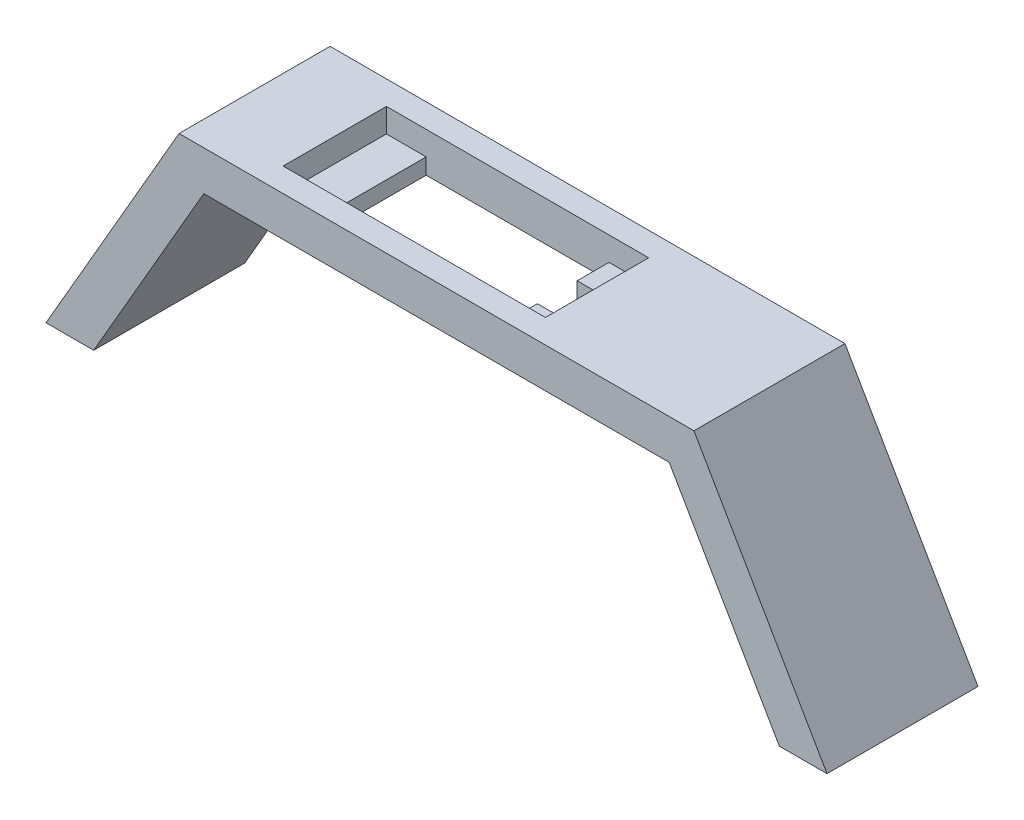
ISO-10303-21;
HEADER;
FILE_DESCRIPTION(('STEP AP214'),'2;1');
FILE_NAME('part.step','',(''),(''),'','','');
FILE_SCHEMA(('AUTOMOTIVE_DESIGN { 1 0 10303 214 1 1 1 1 }'));
ENDSEC;
DATA;
#1=APPLICATION_CONTEXT('core data for automotive mechanical design processes');
#2=APPLICATION_PROTOCOL_DEFINITION('international standard','automotive_design',2000,#1);
#3=PRODUCT_CONTEXT('',#1,'mechanical');
#4=PRODUCT('Part','Part','',(#3));
#5=PRODUCT_RELATED_PRODUCT_CATEGORY('part','',(#4));
#6=PRODUCT_DEFINITION_FORMATION('','',#4);
#7=PRODUCT_DEFINITION_CONTEXT('part definition',#1,'design');
#8=PRODUCT_DEFINITION('design','',#6,#7);
#9=PRODUCT_DEFINITION_SHAPE('','',#8);
#10=(LENGTH_UNIT() NAMED_UNIT(*) SI_UNIT(.MILLI.,.METRE.));
#11=(NAMED_UNIT(*) PLANE_ANGLE_UNIT() SI_UNIT($,.RADIAN.));
#12=(NAMED_UNIT(*) SI_UNIT($,.STERADIAN.) SOLID_ANGLE_UNIT());
#13=UNCERTAINTY_MEASURE_WITH_UNIT(LENGTH_MEASURE(1.E-05),#10,'distance_accuracy_value','');
#14=(GEOMETRIC_REPRESENTATION_CONTEXT(3) GLOBAL_UNCERTAINTY_ASSIGNED_CONTEXT((#13)) GLOBAL_UNIT_ASSIGNED_CONTEXT((#10,
#11,#12)) REPRESENTATION_CONTEXT('',''));
#15=CARTESIAN_POINT('',(0.,0.,0.));
#16=DIRECTION('',(0.,0.,1.));
#17=DIRECTION('',(1.,0.,0.));
#18=AXIS2_PLACEMENT_3D('',#15,#16,#17);
#19=CARTESIAN_POINT('',(0.,2.,0.));
#20=DIRECTION('',(0.,-1.,0.));
#21=DIRECTION('',(1.,0.,0.));
#22=AXIS2_PLACEMENT_3D('',#19,#20,#21);
#23=PLANE('',#22);
#24=DIRECTION('',(0.,0.,-1.));
#25=VECTOR('',#24,1.);
#26=CARTESIAN_POINT('',(5.7,2.,3.));
#27=LINE('',#26,#25);
#28=CARTESIAN_POINT('',(5.7,2.,7.));
#29=VERTEX_POINT('',#28);
#30=CARTESIAN_POINT('',(5.7,2.,3.));
#31=VERTEX_POINT('',#30);
#32=EDGE_CURVE('E202',#29,#31,#27,.T.);
#33=ORIENTED_EDGE('',*,*,#32,.F.);
#34=DIRECTION('',(-1.,0.,0.));
#35=VECTOR('',#34,1.);
#36=CARTESIAN_POINT('',(10.7,2.,7.));
#37=LINE('',#36,#35);
#38=CARTESIAN_POINT('',(10.7,2.,7.));
#39=VERTEX_POINT('',#38);
#40=EDGE_CURVE('E187',#39,#29,#37,.T.);
#41=ORIENTED_EDGE('',*,*,#40,.F.);
#42=DIRECTION('',(0.,0.,-1.));
#43=VECTOR('',#42,1.);
#44=CARTESIAN_POINT('',(10.7,2.00000000000001,3.));
#45=LINE('',#44,#43);
#46=CARTESIAN_POINT('',(10.7,2.00000000000001,3.));
#47=VERTEX_POINT('',#46);
#48=EDGE_CURVE('E228',#39,#47,#45,.T.);
#49=ORIENTED_EDGE('',*,*,#48,.T.);
#50=DIRECTION('',(-1.,0.,0.));
#51=VECTOR('',#50,1.);
#52=CARTESIAN_POINT('',(10.7,2.00000000000001,3.));
#53=LINE('',#52,#51);
#54=EDGE_CURVE('E231',#47,#31,#53,.T.);
#55=ORIENTED_EDGE('',*,*,#54,.T.);
#56=EDGE_LOOP('',(#33,#41,#49,#55));
#57=FACE_BOUND('',#56,.T.);
#58=ADVANCED_FACE('F42',(#57),#23,.F.);
#59=CARTESIAN_POINT('',(5.7,-24.001,3.));
#60=DIRECTION('',(1.,0.,0.));
#61=DIRECTION('',(0.,1.,0.));
#62=AXIS2_PLACEMENT_3D('',#59,#60,#61);
#63=PLANE('',#62);
#64=DIRECTION('',(0.,0.,1.));
#65=VECTOR('',#64,1.);
#66=CARTESIAN_POINT('',(5.7,1.14491749414469E-13,3.));
#67=LINE('',#66,#65);
#68=CARTESIAN_POINT('',(5.7,1.17020051753932E-13,3.));
#69=VERTEX_POINT('',#68);
#70=CARTESIAN_POINT('',(5.7,1.70002900645727E-13,7.));
#71=VERTEX_POINT('',#70);
#72=EDGE_CURVE('E206',#69,#71,#67,.T.);
#73=ORIENTED_EDGE('',*,*,#72,.T.);
#74=DIRECTION('',(0.,1.,0.));
#75=VECTOR('',#74,1.);
#76=CARTESIAN_POINT('',(5.7,-24.001,7.));
#77=LINE('',#76,#75);
#78=EDGE_CURVE('E639',#71,#29,#77,.T.);
#79=ORIENTED_EDGE('',*,*,#78,.T.);
#80=ORIENTED_EDGE('',*,*,#32,.T.);
#81=DIRECTION('',(0.,1.,0.));
#82=VECTOR('',#81,1.);
#83=CARTESIAN_POINT('',(5.7,-24.001,3.));
#84=LINE('',#83,#82);
#85=EDGE_CURVE('E204',#69,#31,#84,.T.);
#86=ORIENTED_EDGE('',*,*,#85,.F.);
#87=EDGE_LOOP('',(#73,#79,#80,#86));
#88=FACE_BOUND('',#87,.T.);
#89=ADVANCED_FACE('F356',(#88),#63,.F.);
#90=CARTESIAN_POINT('',(10.7,2.00000000000001,16.));
#91=VERTEX_POINT('',#90);
#92=CARTESIAN_POINT('',(10.7,2.,12.));
#93=VERTEX_POINT('',#92);
#94=EDGE_CURVE('E195',#91,#93,#45,.T.);
#95=ORIENTED_EDGE('',*,*,#94,.T.);
#96=DIRECTION('',(1.,0.,0.));
#97=VECTOR('',#96,1.);
#98=CARTESIAN_POINT('',(10.7,2.,12.));
#99=LINE('',#98,#97);
#100=CARTESIAN_POINT('',(5.7,2.,12.));
#101=VERTEX_POINT('',#100);
#102=EDGE_CURVE('E181',#101,#93,#99,.T.);
#103=ORIENTED_EDGE('',*,*,#102,.F.);
#104=CARTESIAN_POINT('',(5.7,2.,16.));
#105=VERTEX_POINT('',#104);
#106=EDGE_CURVE('E192',#105,#101,#27,.T.);
#107=ORIENTED_EDGE('',*,*,#106,.F.);
#108=DIRECTION('',(1.,0.,0.));
#109=VECTOR('',#108,1.);
#110=CARTESIAN_POINT('',(10.7,2.00000000000001,16.));
#111=LINE('',#110,#109);
#112=EDGE_CURVE('E223',#105,#91,#111,.T.);
#113=ORIENTED_EDGE('',*,*,#112,.T.);
#114=EDGE_LOOP('',(#95,#103,#107,#113));
#115=FACE_BOUND('',#114,.T.);
#116=ADVANCED_FACE('F191',(#115),#23,.F.);
#117=DIRECTION('',(0.,0.,1.));
#118=VECTOR('',#117,1.);
#119=CARTESIAN_POINT('',(-17.3,2.,3.));
#120=LINE('',#119,#118);
#121=CARTESIAN_POINT('',(-17.3,2.,3.));
#122=VERTEX_POINT('',#121);
#123=CARTESIAN_POINT('',(-17.3,2.,16.));
#124=VERTEX_POINT('',#123);
#125=EDGE_CURVE('E201',#122,#124,#120,.T.);
#126=ORIENTED_EDGE('',*,*,#125,.F.);
#127=CARTESIAN_POINT('',(-22.3,2.,3.));
#128=VERTEX_POINT('',#127);
#129=EDGE_CURVE('E230',#122,#128,#53,.T.);
#130=ORIENTED_EDGE('',*,*,#129,.T.);
#131=DIRECTION('',(0.,0.,1.));
#132=VECTOR('',#131,1.);
#133=CARTESIAN_POINT('',(-22.3,2.,3.));
#134=LINE('',#133,#132);
#135=CARTESIAN_POINT('',(-22.3,2.,16.));
#136=VERTEX_POINT('',#135);
#137=EDGE_CURVE('E220',#128,#136,#134,.T.);
#138=ORIENTED_EDGE('',*,*,#137,.T.);
#139=EDGE_CURVE('E225',#136,#124,#111,.T.);
#140=ORIENTED_EDGE('',*,*,#139,.T.);
#141=EDGE_LOOP('',(#126,#130,#138,#140));
#142=FACE_BOUND('',#141,.T.);
#143=ADVANCED_FACE('F359',(#142),#23,.F.);
#144=CARTESIAN_POINT('',(-43.14,-24.,19.));
#145=DIRECTION('',(-0.866025403784445,0.499999999999989,0.));
#146=DIRECTION('',(-0.499999999999989,-0.866025403784445,0.));
#147=AXIS2_PLACEMENT_3D('',#144,#145,#146);
#148=PLANE('',#147);
#149=DIRECTION('',(0.499999999999989,0.866025403784445,0.));
#150=VECTOR('',#149,1.);
#151=CARTESIAN_POINT('',(-43.14,-24.,0.));
#152=LINE('',#151,#150);
#153=CARTESIAN_POINT('',(-43.14,-24.,0.));
#154=VERTEX_POINT('',#153);
#155=CARTESIAN_POINT('',(-29.2835935394492,2.81672040281602E-13,0.));
#156=VERTEX_POINT('',#155);
#157=EDGE_CURVE('E246',#154,#156,#152,.T.);
#158=ORIENTED_EDGE('',*,*,#157,.T.);
#159=DIRECTION('',(0.,0.,-1.));
#160=VECTOR('',#159,1.);
#161=CARTESIAN_POINT('',(-29.2835935394492,2.81672040281602E-13,19.));
#162=LINE('',#161,#160);
#163=CARTESIAN_POINT('',(-29.2835935394492,2.81672040281602E-13,19.));
#164=VERTEX_POINT('',#163);
#165=EDGE_CURVE('E11',#164,#156,#162,.T.);
#166=ORIENTED_EDGE('',*,*,#165,.F.);
#167=DIRECTION('',(0.499999999999989,0.866025403784445,0.));
#168=VECTOR('',#167,1.);
#169=CARTESIAN_POINT('',(-43.14,-24.,19.));
#170=LINE('',#169,#168);
#171=CARTESIAN_POINT('',(-43.14,-24.,19.));
#172=VERTEX_POINT('',#171);
#173=EDGE_CURVE('E253',#172,#164,#170,.T.);
#174=ORIENTED_EDGE('',*,*,#173,.F.);
#175=DIRECTION('',(0.,0.,-1.));
#176=VECTOR('',#175,1.);
#177=CARTESIAN_POINT('',(-43.14,-24.,19.));
#178=LINE('',#177,#176);
#179=EDGE_CURVE('E271',#172,#154,#178,.T.);
#180=ORIENTED_EDGE('',*,*,#179,.T.);
#181=EDGE_LOOP('',(#158,#166,#174,#180));
#182=FACE_BOUND('',#181,.T.);
#183=ADVANCED_FACE('F44',(#182),#148,.F.);
#184=CARTESIAN_POINT('',(-29.2835935394492,2.81672040281602E-13,19.));
#185=DIRECTION('',(0.,1.,0.));
#186=DIRECTION('',(-1.,0.,0.));
#187=AXIS2_PLACEMENT_3D('',#184,#185,#186);
#188=PLANE('',#187);
#189=DIRECTION('',(0.,0.,1.));
#190=VECTOR('',#189,1.);
#191=CARTESIAN_POINT('',(10.7,0.,7.));
#192=LINE('',#191,#190);
#193=CARTESIAN_POINT('',(10.7,0.,7.));
#194=VERTEX_POINT('',#193);
#195=CARTESIAN_POINT('',(10.7,1.04083408558608E-13,12.));
#196=VERTEX_POINT('',#195);
#197=EDGE_CURVE('E642',#194,#196,#192,.T.);
#198=ORIENTED_EDGE('',*,*,#197,.F.);
#199=DIRECTION('',(1.,0.,0.));
#200=VECTOR('',#199,1.);
#201=CARTESIAN_POINT('',(10.7000000000001,0.,7.));
#202=LINE('',#201,#200);
#203=EDGE_CURVE('E196',#71,#194,#202,.T.);
#204=ORIENTED_EDGE('',*,*,#203,.F.);
#205=ORIENTED_EDGE('',*,*,#72,.F.);
#206=DIRECTION('',(1.,0.,0.));
#207=VECTOR('',#206,1.);
#208=CARTESIAN_POINT('',(-17.2999999999999,2.25514051876985E-13,3.));
#209=LINE('',#208,#207);
#210=CARTESIAN_POINT('',(-17.3,2.25143866414488E-13,3.));
#211=VERTEX_POINT('',#210);
#212=EDGE_CURVE('E211',#211,#69,#209,.T.);
#213=ORIENTED_EDGE('',*,*,#212,.F.);
#214=DIRECTION('',(0.,0.,-1.));
#215=VECTOR('',#214,1.);
#216=CARTESIAN_POINT('',(-17.3,2.25514051876985E-13,3.));
#217=LINE('',#216,#215);
#218=CARTESIAN_POINT('',(-17.3,2.25514051876985E-13,16.));
#219=VERTEX_POINT('',#218);
#220=EDGE_CURVE('E652',#219,#211,#217,.T.);
#221=ORIENTED_EDGE('',*,*,#220,.F.);
#222=DIRECTION('',(-1.,0.,0.));
#223=VECTOR('',#222,1.);
#224=CARTESIAN_POINT('',(-17.2999999999999,2.25514051876985E-13,16.));
#225=LINE('',#224,#223);
#226=CARTESIAN_POINT('',(5.7,1.70002900645727E-13,16.));
#227=VERTEX_POINT('',#226);
#228=EDGE_CURVE('E653',#227,#219,#225,.T.);
#229=ORIENTED_EDGE('',*,*,#228,.F.);
#230=CARTESIAN_POINT('',(5.7,1.14491749414469E-13,12.));
#231=VERTEX_POINT('',#230);
#232=EDGE_CURVE('E655',#231,#227,#67,.T.);
#233=ORIENTED_EDGE('',*,*,#232,.F.);
#234=DIRECTION('',(-1.,0.,0.));
#235=VECTOR('',#234,1.);
#236=CARTESIAN_POINT('',(10.7000000000001,0.,12.));
#237=LINE('',#236,#235);
#238=EDGE_CURVE('E57',#196,#231,#237,.T.);
#239=ORIENTED_EDGE('',*,*,#238,.F.);
#240=EDGE_LOOP('',(#198,#204,#205,#213,#221,#229,#233,#239));
#241=FACE_BOUND('',#240,.T.);
#242=DIRECTION('',(1.,0.,0.));
#243=VECTOR('',#242,1.);
#244=CARTESIAN_POINT('',(-29.2835935394492,2.81672040281602E-13,0.));
#245=LINE('',#244,#243);
#246=CARTESIAN_POINT('',(29.2835935394491,0.,0.));
#247=VERTEX_POINT('',#246);
#248=EDGE_CURVE('E274',#156,#247,#245,.T.);
#249=ORIENTED_EDGE('',*,*,#248,.T.);
#250=DIRECTION('',(0.,0.,-1.));
#251=VECTOR('',#250,1.);
#252=CARTESIAN_POINT('',(29.2835935394491,0.,19.));
#253=LINE('',#252,#251);
#254=CARTESIAN_POINT('',(29.2835935394491,0.,19.));
#255=VERTEX_POINT('',#254);
#256=EDGE_CURVE('E50',#255,#247,#253,.T.);
#257=ORIENTED_EDGE('',*,*,#256,.F.);
#258=DIRECTION('',(1.,0.,0.));
#259=VECTOR('',#258,1.);
#260=CARTESIAN_POINT('',(-29.2835935394492,2.81672040281602E-13,19.));
#261=LINE('',#260,#259);
#262=EDGE_CURVE('E256',#164,#255,#261,.T.);
#263=ORIENTED_EDGE('',*,*,#262,.F.);
#264=ORIENTED_EDGE('',*,*,#165,.T.);
#265=EDGE_LOOP('',(#249,#257,#263,#264));
#266=FACE_BOUND('',#265,.T.);
#267=ADVANCED_FACE('F331',(#241,#266),#188,.F.);
#268=CARTESIAN_POINT('',(29.2835935394491,0.,19.));
#269=DIRECTION('',(0.86602540378444,0.499999999999998,0.));
#270=DIRECTION('',(-0.499999999999998,0.86602540378444,0.));
#271=AXIS2_PLACEMENT_3D('',#268,#269,#270);
#272=PLANE('',#271);
#273=DIRECTION('',(0.499999999999998,-0.86602540378444,0.));
#274=VECTOR('',#273,1.);
#275=CARTESIAN_POINT('',(29.2835935394491,0.,0.));
#276=LINE('',#275,#274);
#277=CARTESIAN_POINT('',(43.14,-24.,0.));
#278=VERTEX_POINT('',#277);
#279=EDGE_CURVE('E276',#247,#278,#276,.T.);
#280=ORIENTED_EDGE('',*,*,#279,.T.);
#281=DIRECTION('',(0.,0.,-1.));
#282=VECTOR('',#281,1.);
#283=CARTESIAN_POINT('',(43.14,-24.,19.));
#284=LINE('',#283,#282);
#285=CARTESIAN_POINT('',(43.14,-24.,19.));
#286=VERTEX_POINT('',#285);
#287=EDGE_CURVE('E301',#286,#278,#284,.T.);
#288=ORIENTED_EDGE('',*,*,#287,.F.);
#289=DIRECTION('',(0.499999999999998,-0.86602540378444,0.));
#290=VECTOR('',#289,1.);
#291=CARTESIAN_POINT('',(29.2835935394491,0.,19.));
#292=LINE('',#291,#290);
#293=EDGE_CURVE('E259',#255,#286,#292,.T.);
#294=ORIENTED_EDGE('',*,*,#293,.F.);
#295=ORIENTED_EDGE('',*,*,#256,.T.);
#296=EDGE_LOOP('',(#280,#288,#294,#295));
#297=FACE_BOUND('',#296,.T.);
#298=ADVANCED_FACE('F308',(#297),#272,.F.);
#299=CARTESIAN_POINT('',(43.14,-24.,19.));
#300=DIRECTION('',(0.,1.,0.));
#301=DIRECTION('',(-1.,0.,0.));
#302=AXIS2_PLACEMENT_3D('',#299,#300,#301);
#303=PLANE('',#302);
#304=DIRECTION('',(1.,0.,0.));
#305=VECTOR('',#304,1.);
#306=CARTESIAN_POINT('',(43.14,-24.,0.));
#307=LINE('',#306,#305);
#308=CARTESIAN_POINT('',(49.14,-24.,0.));
#309=VERTEX_POINT('',#308);
#310=EDGE_CURVE('E278',#278,#309,#307,.T.);
#311=ORIENTED_EDGE('',*,*,#310,.T.);
#312=DIRECTION('',(0.,0.,-1.));
#313=VECTOR('',#312,1.);
#314=CARTESIAN_POINT('',(49.14,-24.,19.));
#315=LINE('',#314,#313);
#316=CARTESIAN_POINT('',(49.14,-24.,19.));
#317=VERTEX_POINT('',#316);
#318=EDGE_CURVE('E298',#317,#309,#315,.T.);
#319=ORIENTED_EDGE('',*,*,#318,.F.);
#320=DIRECTION('',(1.,0.,0.));
#321=VECTOR('',#320,1.);
#322=CARTESIAN_POINT('',(43.14,-24.,19.));
#323=LINE('',#322,#321);
#324=EDGE_CURVE('E261',#286,#317,#323,.T.);
#325=ORIENTED_EDGE('',*,*,#324,.F.);
#326=ORIENTED_EDGE('',*,*,#287,.T.);
#327=EDGE_LOOP('',(#311,#319,#325,#326));
#328=FACE_BOUND('',#327,.T.);
#329=ADVANCED_FACE('F319',(#328),#303,.F.);
#330=CARTESIAN_POINT('',(49.14,-24.,19.));
#331=DIRECTION('',(-0.86602540378444,-0.499999999999997,0.));
#332=DIRECTION('',(0.499999999999997,-0.86602540378444,0.));
#333=AXIS2_PLACEMENT_3D('',#330,#331,#332);
#334=PLANE('',#333);
#335=DIRECTION('',(-0.499999999999997,0.86602540378444,0.));
#336=VECTOR('',#335,1.);
#337=CARTESIAN_POINT('',(49.14,-24.,0.));
#338=LINE('',#337,#336);
#339=CARTESIAN_POINT('',(32.396842193501,5.00000000000001,0.));
#340=VERTEX_POINT('',#339);
#341=EDGE_CURVE('E280',#309,#340,#338,.T.);
#342=ORIENTED_EDGE('',*,*,#341,.T.);
#343=DIRECTION('',(0.,0.,-1.));
#344=VECTOR('',#343,1.);
#345=CARTESIAN_POINT('',(32.396842193501,5.00000000000001,19.));
#346=LINE('',#345,#344);
#347=CARTESIAN_POINT('',(32.396842193501,5.00000000000001,19.));
#348=VERTEX_POINT('',#347);
#349=EDGE_CURVE('E295',#348,#340,#346,.T.);
#350=ORIENTED_EDGE('',*,*,#349,.F.);
#351=DIRECTION('',(-0.499999999999997,0.86602540378444,0.));
#352=VECTOR('',#351,1.);
#353=CARTESIAN_POINT('',(49.14,-24.,19.));
#354=LINE('',#353,#352);
#355=EDGE_CURVE('E263',#317,#348,#354,.T.);
#356=ORIENTED_EDGE('',*,*,#355,.F.);
#357=ORIENTED_EDGE('',*,*,#318,.T.);
#358=EDGE_LOOP('',(#342,#350,#356,#357));
#359=FACE_BOUND('',#358,.T.);
#360=ADVANCED_FACE('F323',(#359),#334,.F.);
#361=CARTESIAN_POINT('',(32.396842193501,5.00000000000001,19.));
#362=DIRECTION('',(0.,-1.,0.));
#363=DIRECTION('',(1.,0.,0.));
#364=AXIS2_PLACEMENT_3D('',#361,#362,#363);
#365=PLANE('',#364);
#366=DIRECTION('',(1.,0.,0.));
#367=VECTOR('',#366,1.);
#368=CARTESIAN_POINT('',(10.7,5.00000000000001,16.));
#369=LINE('',#368,#367);
#370=CARTESIAN_POINT('',(-22.3,5.,16.));
#371=VERTEX_POINT('',#370);
#372=CARTESIAN_POINT('',(10.7,5.00000000000001,16.));
#373=VERTEX_POINT('',#372);
#374=EDGE_CURVE('E236',#371,#373,#369,.T.);
#375=ORIENTED_EDGE('',*,*,#374,.F.);
#376=DIRECTION('',(0.,0.,1.));
#377=VECTOR('',#376,1.);
#378=CARTESIAN_POINT('',(-22.3,5.,3.));
#379=LINE('',#378,#377);
#380=CARTESIAN_POINT('',(-22.3,5.,3.));
#381=VERTEX_POINT('',#380);
#382=EDGE_CURVE('E219',#381,#371,#379,.T.);
#383=ORIENTED_EDGE('',*,*,#382,.F.);
#384=DIRECTION('',(-1.,0.,0.));
#385=VECTOR('',#384,1.);
#386=CARTESIAN_POINT('',(10.7,5.00000000000001,3.));
#387=LINE('',#386,#385);
#388=CARTESIAN_POINT('',(10.7,5.00000000000001,3.));
#389=VERTEX_POINT('',#388);
#390=EDGE_CURVE('E224',#389,#381,#387,.T.);
#391=ORIENTED_EDGE('',*,*,#390,.F.);
#392=DIRECTION('',(0.,0.,-1.));
#393=VECTOR('',#392,1.);
#394=CARTESIAN_POINT('',(10.7,5.00000000000001,3.));
#395=LINE('',#394,#393);
#396=EDGE_CURVE('E239',#373,#389,#395,.T.);
#397=ORIENTED_EDGE('',*,*,#396,.F.);
#398=EDGE_LOOP('',(#375,#383,#391,#397));
#399=FACE_BOUND('',#398,.T.);
#400=DIRECTION('',(-1.,0.,0.));
#401=VECTOR('',#400,1.);
#402=CARTESIAN_POINT('',(32.396842193501,5.00000000000001,0.));
#403=LINE('',#402,#401);
#404=CARTESIAN_POINT('',(-32.396842193501,5.,0.));
#405=VERTEX_POINT('',#404);
#406=EDGE_CURVE('E282',#340,#405,#403,.T.);
#407=ORIENTED_EDGE('',*,*,#406,.T.);
#408=DIRECTION('',(0.,0.,-1.));
#409=VECTOR('',#408,1.);
#410=CARTESIAN_POINT('',(-32.396842193501,5.,19.));
#411=LINE('',#410,#409);
#412=CARTESIAN_POINT('',(-32.396842193501,5.,19.));
#413=VERTEX_POINT('',#412);
#414=EDGE_CURVE('E292',#413,#405,#411,.T.);
#415=ORIENTED_EDGE('',*,*,#414,.F.);
#416=DIRECTION('',(-1.,0.,0.));
#417=VECTOR('',#416,1.);
#418=CARTESIAN_POINT('',(32.396842193501,5.00000000000001,19.));
#419=LINE('',#418,#417);
#420=EDGE_CURVE('E265',#348,#413,#419,.T.);
#421=ORIENTED_EDGE('',*,*,#420,.F.);
#422=ORIENTED_EDGE('',*,*,#349,.T.);
#423=EDGE_LOOP('',(#407,#415,#421,#422));
#424=FACE_BOUND('',#423,.T.);
#425=ADVANCED_FACE('F344',(#399,#424),#365,.F.);
#426=CARTESIAN_POINT('',(-32.396842193501,5.,19.));
#427=DIRECTION('',(0.86602540378444,-0.499999999999998,0.));
#428=DIRECTION('',(0.499999999999998,0.86602540378444,0.));
#429=AXIS2_PLACEMENT_3D('',#426,#427,#428);
#430=PLANE('',#429);
#431=DIRECTION('',(-0.499999999999998,-0.86602540378444,0.));
#432=VECTOR('',#431,1.);
#433=CARTESIAN_POINT('',(-32.396842193501,5.,0.));
#434=LINE('',#433,#432);
#435=CARTESIAN_POINT('',(-49.14,-24.,0.));
#436=VERTEX_POINT('',#435);
#437=EDGE_CURVE('E284',#405,#436,#434,.T.);
#438=ORIENTED_EDGE('',*,*,#437,.T.);
#439=DIRECTION('',(0.,0.,-1.));
#440=VECTOR('',#439,1.);
#441=CARTESIAN_POINT('',(-49.14,-24.,19.));
#442=LINE('',#441,#440);
#443=CARTESIAN_POINT('',(-49.14,-24.,19.));
#444=VERTEX_POINT('',#443);
#445=EDGE_CURVE('E289',#444,#436,#442,.T.);
#446=ORIENTED_EDGE('',*,*,#445,.F.);
#447=DIRECTION('',(-0.499999999999998,-0.86602540378444,0.));
#448=VECTOR('',#447,1.);
#449=CARTESIAN_POINT('',(-32.396842193501,5.,19.));
#450=LINE('',#449,#448);
#451=EDGE_CURVE('E267',#413,#444,#450,.T.);
#452=ORIENTED_EDGE('',*,*,#451,.F.);
#453=ORIENTED_EDGE('',*,*,#414,.T.);
#454=EDGE_LOOP('',(#438,#446,#452,#453));
#455=FACE_BOUND('',#454,.T.);
#456=ADVANCED_FACE('F342',(#455),#430,.F.);
#457=CARTESIAN_POINT('',(-49.14,-24.,19.));
#458=DIRECTION('',(0.,1.,0.));
#459=DIRECTION('',(0.,0.,1.));
#460=AXIS2_PLACEMENT_3D('',#457,#458,#459);
#461=PLANE('',#460);
#462=DIRECTION('',(1.,0.,0.));
#463=VECTOR('',#462,1.);
#464=CARTESIAN_POINT('',(-49.14,-24.,0.));
#465=LINE('',#464,#463);
#466=EDGE_CURVE('E257',#436,#154,#465,.T.);
#467=ORIENTED_EDGE('',*,*,#466,.T.);
#468=ORIENTED_EDGE('',*,*,#179,.F.);
#469=DIRECTION('',(1.,0.,0.));
#470=VECTOR('',#469,1.);
#471=CARTESIAN_POINT('',(-49.14,-24.,19.));
#472=LINE('',#471,#470);
#473=EDGE_CURVE('E269',#444,#172,#472,.T.);
#474=ORIENTED_EDGE('',*,*,#473,.F.);
#475=ORIENTED_EDGE('',*,*,#445,.T.);
#476=EDGE_LOOP('',(#467,#468,#474,#475));
#477=FACE_BOUND('',#476,.T.);
#478=ADVANCED_FACE('F337',(#477),#461,.F.);
#479=CARTESIAN_POINT('',(0.,0.,19.));
#480=DIRECTION('',(0.,0.,-1.));
#481=DIRECTION('',(-1.,0.,0.));
#482=AXIS2_PLACEMENT_3D('',#479,#480,#481);
#483=PLANE('',#482);
#484=ORIENTED_EDGE('',*,*,#173,.T.);
#485=ORIENTED_EDGE('',*,*,#262,.T.);
#486=ORIENTED_EDGE('',*,*,#293,.T.);
#487=ORIENTED_EDGE('',*,*,#324,.T.);
#488=ORIENTED_EDGE('',*,*,#355,.T.);
#489=ORIENTED_EDGE('',*,*,#420,.T.);
#490=ORIENTED_EDGE('',*,*,#451,.T.);
#491=ORIENTED_EDGE('',*,*,#473,.T.);
#492=EDGE_LOOP('',(#484,#485,#486,#487,#488,#489,#490,#491));
#493=FACE_BOUND('',#492,.T.);
#494=ADVANCED_FACE('F327',(#493),#483,.F.);
#495=CARTESIAN_POINT('',(0.,0.,0.));
#496=DIRECTION('',(0.,0.,-1.));
#497=DIRECTION('',(-1.,0.,0.));
#498=AXIS2_PLACEMENT_3D('',#495,#496,#497);
#499=PLANE('',#498);
#500=ORIENTED_EDGE('',*,*,#157,.F.);
#501=ORIENTED_EDGE('',*,*,#466,.F.);
#502=ORIENTED_EDGE('',*,*,#437,.F.);
#503=ORIENTED_EDGE('',*,*,#406,.F.);
#504=ORIENTED_EDGE('',*,*,#341,.F.);
#505=ORIENTED_EDGE('',*,*,#310,.F.);
#506=ORIENTED_EDGE('',*,*,#279,.F.);
#507=ORIENTED_EDGE('',*,*,#248,.F.);
#508=EDGE_LOOP('',(#500,#501,#502,#503,#504,#505,#506,#507));
#509=FACE_BOUND('',#508,.T.);
#510=ADVANCED_FACE('F314',(#509),#499,.T.);
#511=CARTESIAN_POINT('',(-22.3,2.,3.));
#512=DIRECTION('',(-1.,0.,0.));
#513=DIRECTION('',(0.,0.,1.));
#514=AXIS2_PLACEMENT_3D('',#511,#512,#513);
#515=PLANE('',#514);
#516=ORIENTED_EDGE('',*,*,#382,.T.);
#517=DIRECTION('',(0.,1.,0.));
#518=VECTOR('',#517,1.);
#519=CARTESIAN_POINT('',(-22.3,2.,16.));
#520=LINE('',#519,#518);
#521=EDGE_CURVE('E234',#136,#371,#520,.T.);
#522=ORIENTED_EDGE('',*,*,#521,.F.);
#523=ORIENTED_EDGE('',*,*,#137,.F.);
#524=DIRECTION('',(0.,1.,0.));
#525=VECTOR('',#524,1.);
#526=CARTESIAN_POINT('',(-22.3,2.,3.));
#527=LINE('',#526,#525);
#528=EDGE_CURVE('E244',#128,#381,#527,.T.);
#529=ORIENTED_EDGE('',*,*,#528,.T.);
#530=EDGE_LOOP('',(#516,#522,#523,#529));
#531=FACE_BOUND('',#530,.T.);
#532=ADVANCED_FACE('F441',(#531),#515,.F.);
#533=CARTESIAN_POINT('',(10.7,2.00000000000001,3.));
#534=DIRECTION('',(0.,0.,-1.));
#535=DIRECTION('',(-1.,0.,0.));
#536=AXIS2_PLACEMENT_3D('',#533,#534,#535);
#537=PLANE('',#536);
#538=ORIENTED_EDGE('',*,*,#390,.T.);
#539=ORIENTED_EDGE('',*,*,#528,.F.);
#540=ORIENTED_EDGE('',*,*,#129,.F.);
#541=DIRECTION('',(0.,1.,0.));
#542=VECTOR('',#541,1.);
#543=CARTESIAN_POINT('',(-17.3,-24.001,3.));
#544=LINE('',#543,#542);
#545=EDGE_CURVE('E65',#211,#122,#544,.T.);
#546=ORIENTED_EDGE('',*,*,#545,.F.);
#547=ORIENTED_EDGE('',*,*,#212,.T.);
#548=ORIENTED_EDGE('',*,*,#85,.T.);
#549=ORIENTED_EDGE('',*,*,#54,.F.);
#550=DIRECTION('',(0.,1.,0.));
#551=VECTOR('',#550,1.);
#552=CARTESIAN_POINT('',(10.7,2.00000000000001,3.));
#553=LINE('',#552,#551);
#554=EDGE_CURVE('E247',#47,#389,#553,.T.);
#555=ORIENTED_EDGE('',*,*,#554,.T.);
#556=EDGE_LOOP('',(#538,#539,#540,#546,#547,#548,#549,#555));
#557=FACE_BOUND('',#556,.T.);
#558=ADVANCED_FACE('F449',(#557),#537,.F.);
#559=CARTESIAN_POINT('',(10.7,2.00000000000001,3.));
#560=DIRECTION('',(1.,0.,0.));
#561=DIRECTION('',(0.,1.,0.));
#562=AXIS2_PLACEMENT_3D('',#559,#560,#561);
#563=PLANE('',#562);
#564=ORIENTED_EDGE('',*,*,#396,.T.);
#565=ORIENTED_EDGE('',*,*,#554,.F.);
#566=ORIENTED_EDGE('',*,*,#48,.F.);
#567=DIRECTION('',(0.,1.,0.));
#568=VECTOR('',#567,1.);
#569=CARTESIAN_POINT('',(10.7,-24.001,7.));
#570=LINE('',#569,#568);
#571=EDGE_CURVE('E636',#194,#39,#570,.T.);
#572=ORIENTED_EDGE('',*,*,#571,.F.);
#573=ORIENTED_EDGE('',*,*,#197,.T.);
#574=DIRECTION('',(0.,1.,0.));
#575=VECTOR('',#574,1.);
#576=CARTESIAN_POINT('',(10.7,-24.001,12.));
#577=LINE('',#576,#575);
#578=EDGE_CURVE('E186',#196,#93,#577,.T.);
#579=ORIENTED_EDGE('',*,*,#578,.T.);
#580=ORIENTED_EDGE('',*,*,#94,.F.);
#581=DIRECTION('',(0.,1.,0.));
#582=VECTOR('',#581,1.);
#583=CARTESIAN_POINT('',(10.7,2.00000000000001,16.));
#584=LINE('',#583,#582);
#585=EDGE_CURVE('E249',#91,#373,#584,.T.);
#586=ORIENTED_EDGE('',*,*,#585,.T.);
#587=EDGE_LOOP('',(#564,#565,#566,#572,#573,#579,#580,#586));
#588=FACE_BOUND('',#587,.T.);
#589=ADVANCED_FACE('F459',(#588),#563,.F.);
#590=CARTESIAN_POINT('',(10.7,2.00000000000001,16.));
#591=DIRECTION('',(0.,0.,1.));
#592=DIRECTION('',(1.,0.,0.));
#593=AXIS2_PLACEMENT_3D('',#590,#591,#592);
#594=PLANE('',#593);
#595=ORIENTED_EDGE('',*,*,#374,.T.);
#596=ORIENTED_EDGE('',*,*,#585,.F.);
#597=ORIENTED_EDGE('',*,*,#112,.F.);
#598=DIRECTION('',(0.,1.,0.));
#599=VECTOR('',#598,1.);
#600=CARTESIAN_POINT('',(5.7,-24.001,16.));
#601=LINE('',#600,#599);
#602=EDGE_CURVE('E200',#227,#105,#601,.T.);
#603=ORIENTED_EDGE('',*,*,#602,.F.);
#604=ORIENTED_EDGE('',*,*,#228,.T.);
#605=DIRECTION('',(0.,1.,0.));
#606=VECTOR('',#605,1.);
#607=CARTESIAN_POINT('',(-17.3,-24.001,16.));
#608=LINE('',#607,#606);
#609=EDGE_CURVE('E212',#219,#124,#608,.T.);
#610=ORIENTED_EDGE('',*,*,#609,.T.);
#611=ORIENTED_EDGE('',*,*,#139,.F.);
#612=ORIENTED_EDGE('',*,*,#521,.T.);
#613=EDGE_LOOP('',(#595,#596,#597,#603,#604,#610,#611,#612));
#614=FACE_BOUND('',#613,.T.);
#615=ADVANCED_FACE('F469',(#614),#594,.F.);
#616=ORIENTED_EDGE('',*,*,#106,.T.);
#617=DIRECTION('',(0.,1.,0.));
#618=VECTOR('',#617,1.);
#619=CARTESIAN_POINT('',(5.7,-24.001,12.));
#620=LINE('',#619,#618);
#621=EDGE_CURVE('E178',#231,#101,#620,.T.);
#622=ORIENTED_EDGE('',*,*,#621,.F.);
#623=ORIENTED_EDGE('',*,*,#232,.T.);
#624=ORIENTED_EDGE('',*,*,#602,.T.);
#625=EDGE_LOOP('',(#616,#622,#623,#624));
#626=FACE_BOUND('',#625,.T.);
#627=ADVANCED_FACE('F198',(#626),#63,.F.);
#628=CARTESIAN_POINT('',(-17.3,-24.001,3.));
#629=DIRECTION('',(-1.,0.,0.));
#630=DIRECTION('',(0.,0.,1.));
#631=AXIS2_PLACEMENT_3D('',#628,#629,#630);
#632=PLANE('',#631);
#633=ORIENTED_EDGE('',*,*,#220,.T.);
#634=ORIENTED_EDGE('',*,*,#545,.T.);
#635=ORIENTED_EDGE('',*,*,#125,.T.);
#636=ORIENTED_EDGE('',*,*,#609,.F.);
#637=EDGE_LOOP('',(#633,#634,#635,#636));
#638=FACE_BOUND('',#637,.T.);
#639=ADVANCED_FACE('F488',(#638),#632,.F.);
#640=CARTESIAN_POINT('',(10.7,-24.001,7.));
#641=DIRECTION('',(0.,0.,-1.));
#642=DIRECTION('',(-1.,0.,0.));
#643=AXIS2_PLACEMENT_3D('',#640,#641,#642);
#644=PLANE('',#643);
#645=ORIENTED_EDGE('',*,*,#203,.T.);
#646=ORIENTED_EDGE('',*,*,#571,.T.);
#647=ORIENTED_EDGE('',*,*,#40,.T.);
#648=ORIENTED_EDGE('',*,*,#78,.F.);
#649=EDGE_LOOP('',(#645,#646,#647,#648));
#650=FACE_BOUND('',#649,.T.);
#651=ADVANCED_FACE('F496',(#650),#644,.F.);
#652=CARTESIAN_POINT('',(10.7,-24.001,12.));
#653=DIRECTION('',(0.,0.,1.));
#654=DIRECTION('',(1.,0.,0.));
#655=AXIS2_PLACEMENT_3D('',#652,#653,#654);
#656=PLANE('',#655);
#657=ORIENTED_EDGE('',*,*,#238,.T.);
#658=ORIENTED_EDGE('',*,*,#621,.T.);
#659=ORIENTED_EDGE('',*,*,#102,.T.);
#660=ORIENTED_EDGE('',*,*,#578,.F.);
#661=EDGE_LOOP('',(#657,#658,#659,#660));
#662=FACE_BOUND('',#661,.T.);
#663=ADVANCED_FACE('F180',(#662),#656,.F.);
#664=CLOSED_SHELL('',(#58,#89,#116,#143,#183,#267,#298,#329,#360,#425,#456,#478,#494,#510,#532,
#558,#589,#615,#627,#639,#651,#663));
#665=MANIFOLD_SOLID_BREP('B2',#664);
#666=ADVANCED_BREP_SHAPE_REPRESENTATION('',(#18,#665),#14);
#667=SHAPE_DEFINITION_REPRESENTATION(#9,#666);
ENDSEC;
END-ISO-10303-21;
